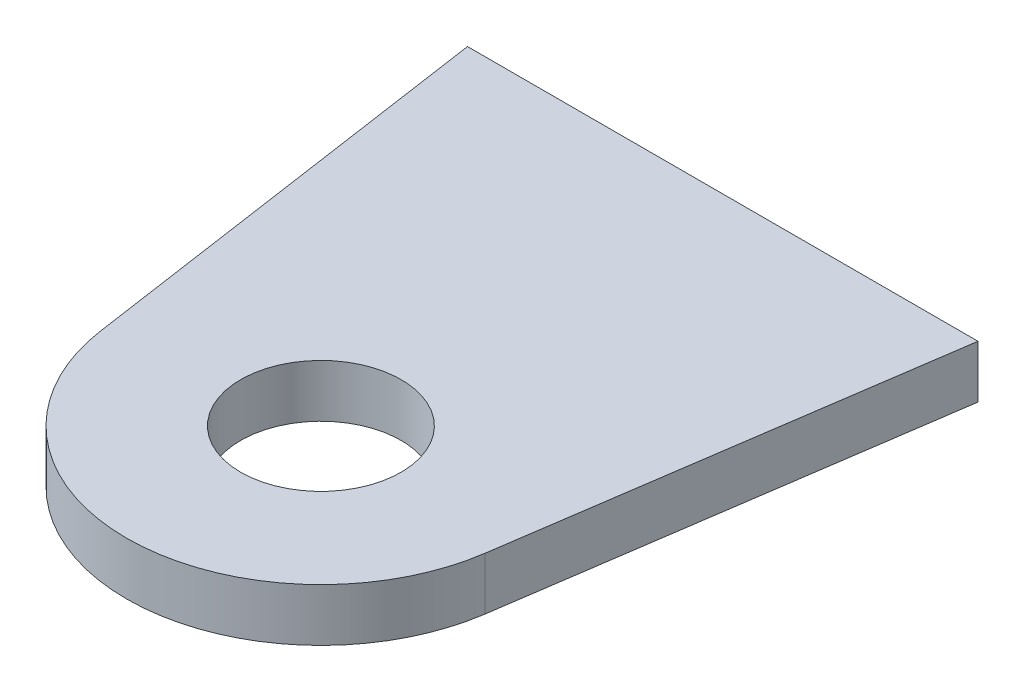
ISO-10303-21;
HEADER;
FILE_DESCRIPTION(('STEP AP214'),'2;1');
FILE_NAME('part.step','',(''),(''),'','','');
FILE_SCHEMA(('AUTOMOTIVE_DESIGN { 1 0 10303 214 1 1 1 1 }'));
ENDSEC;
DATA;
#1=APPLICATION_CONTEXT('core data for automotive mechanical design processes');
#2=APPLICATION_PROTOCOL_DEFINITION('international standard','automotive_design',2000,#1);
#3=PRODUCT_CONTEXT('',#1,'mechanical');
#4=PRODUCT('Part','Part','',(#3));
#5=PRODUCT_RELATED_PRODUCT_CATEGORY('part','',(#4));
#6=PRODUCT_DEFINITION_FORMATION('','',#4);
#7=PRODUCT_DEFINITION_CONTEXT('part definition',#1,'design');
#8=PRODUCT_DEFINITION('design','',#6,#7);
#9=PRODUCT_DEFINITION_SHAPE('','',#8);
#10=(LENGTH_UNIT() NAMED_UNIT(*) SI_UNIT(.MILLI.,.METRE.));
#11=(NAMED_UNIT(*) PLANE_ANGLE_UNIT() SI_UNIT($,.RADIAN.));
#12=(NAMED_UNIT(*) SI_UNIT($,.STERADIAN.) SOLID_ANGLE_UNIT());
#13=UNCERTAINTY_MEASURE_WITH_UNIT(LENGTH_MEASURE(1.E-05),#10,'distance_accuracy_value','');
#14=(GEOMETRIC_REPRESENTATION_CONTEXT(3) GLOBAL_UNCERTAINTY_ASSIGNED_CONTEXT((#13)) GLOBAL_UNIT_ASSIGNED_CONTEXT((#10,
#11,#12)) REPRESENTATION_CONTEXT('',''));
#15=CARTESIAN_POINT('',(0.,0.,0.));
#16=DIRECTION('',(0.,0.,1.));
#17=DIRECTION('',(1.,0.,0.));
#18=AXIS2_PLACEMENT_3D('',#15,#16,#17);
#19=CARTESIAN_POINT('',(-15.875,-1.6383,-24.9936));
#20=DIRECTION('',(-0.989470482255006,0.,0.144734808342864));
#21=DIRECTION('',(0.144734808342864,0.,0.989470482255006));
#22=AXIS2_PLACEMENT_3D('',#19,#20,#21);
#23=PLANE('',#22);
#24=DIRECTION('',(0.144734808342864,0.,0.989470482255006));
#25=VECTOR('',#24,1.);
#26=CARTESIAN_POINT('',(-15.875,1.6383,-24.9936));
#27=LINE('',#26,#25);
#28=CARTESIAN_POINT('',(-15.875,1.6383,-24.9936));
#29=VERTEX_POINT('',#28);
#30=CARTESIAN_POINT('',(-11.9630939186559,1.6383,1.74990172678855));
#31=VERTEX_POINT('',#30);
#32=EDGE_CURVE('E85',#29,#31,#27,.T.);
#33=ORIENTED_EDGE('',*,*,#32,.F.);
#34=DIRECTION('',(0.,1.,0.));
#35=VECTOR('',#34,1.);
#36=CARTESIAN_POINT('',(-15.875,-1.6383,-24.9936));
#37=LINE('',#36,#35);
#38=CARTESIAN_POINT('',(-15.875,-1.6383,-24.9936));
#39=VERTEX_POINT('',#38);
#40=EDGE_CURVE('E31',#39,#29,#37,.T.);
#41=ORIENTED_EDGE('',*,*,#40,.F.);
#42=DIRECTION('',(0.144734808342864,0.,0.989470482255006));
#43=VECTOR('',#42,1.);
#44=CARTESIAN_POINT('',(-15.875,-1.6383,-24.9936));
#45=LINE('',#44,#43);
#46=CARTESIAN_POINT('',(-11.9630939186559,-1.6383,1.74990172678855));
#47=VERTEX_POINT('',#46);
#48=EDGE_CURVE('E70',#39,#47,#45,.T.);
#49=ORIENTED_EDGE('',*,*,#48,.T.);
#50=DIRECTION('',(0.,1.,0.));
#51=VECTOR('',#50,1.);
#52=CARTESIAN_POINT('',(-11.9630939186559,-1.6383,1.74990172678855));
#53=LINE('',#52,#51);
#54=EDGE_CURVE('E9',#47,#31,#53,.T.);
#55=ORIENTED_EDGE('',*,*,#54,.T.);
#56=EDGE_LOOP('',(#33,#41,#49,#55));
#57=FACE_BOUND('',#56,.T.);
#58=ADVANCED_FACE('F15',(#57),#23,.T.);
#59=CARTESIAN_POINT('',(0.,-1.6383,0.));
#60=DIRECTION('',(0.,1.,0.));
#61=DIRECTION('',(0.,0.,1.));
#62=AXIS2_PLACEMENT_3D('',#59,#60,#61);
#63=CYLINDRICAL_SURFACE('',#62,12.0904);
#64=CARTESIAN_POINT('',(0.,1.6383,0.));
#65=DIRECTION('',(0.,1.,0.));
#66=DIRECTION('',(1.,0.,0.));
#67=AXIS2_PLACEMENT_3D('',#64,#65,#66);
#68=CIRCLE('',#67,12.0904);
#69=CARTESIAN_POINT('',(11.9630939186559,1.6383,1.74990172678857));
#70=VERTEX_POINT('',#69);
#71=EDGE_CURVE('E82',#31,#70,#68,.T.);
#72=ORIENTED_EDGE('',*,*,#71,.F.);
#73=ORIENTED_EDGE('',*,*,#54,.F.);
#74=CARTESIAN_POINT('',(0.,-1.6383,0.));
#75=DIRECTION('',(0.,1.,0.));
#76=DIRECTION('',(1.,0.,0.));
#77=AXIS2_PLACEMENT_3D('',#74,#75,#76);
#78=CIRCLE('',#77,12.0904);
#79=CARTESIAN_POINT('',(11.9630939186559,-1.6383,1.74990172678857));
#80=VERTEX_POINT('',#79);
#81=EDGE_CURVE('E66',#47,#80,#78,.T.);
#82=ORIENTED_EDGE('',*,*,#81,.T.);
#83=DIRECTION('',(0.,1.,0.));
#84=VECTOR('',#83,1.);
#85=CARTESIAN_POINT('',(11.9630939186559,-1.6383,1.74990172678857));
#86=LINE('',#85,#84);
#87=EDGE_CURVE('E23',#80,#70,#86,.T.);
#88=ORIENTED_EDGE('',*,*,#87,.T.);
#89=EDGE_LOOP('',(#72,#73,#82,#88));
#90=FACE_BOUND('',#89,.T.);
#91=ADVANCED_FACE('F67',(#90),#63,.T.);
#92=CARTESIAN_POINT('',(11.9630939186559,-1.6383,1.74990172678857));
#93=DIRECTION('',(0.989470482255006,0.,0.144734808342865));
#94=DIRECTION('',(0.144734808342865,0.,-0.989470482255006));
#95=AXIS2_PLACEMENT_3D('',#92,#93,#94);
#96=PLANE('',#95);
#97=DIRECTION('',(0.144734808342865,0.,-0.989470482255006));
#98=VECTOR('',#97,1.);
#99=CARTESIAN_POINT('',(11.9630939186559,1.6383,1.74990172678857));
#100=LINE('',#99,#98);
#101=CARTESIAN_POINT('',(15.875,1.6383,-24.9936));
#102=VERTEX_POINT('',#101);
#103=EDGE_CURVE('E64',#70,#102,#100,.T.);
#104=ORIENTED_EDGE('',*,*,#103,.F.);
#105=ORIENTED_EDGE('',*,*,#87,.F.);
#106=DIRECTION('',(0.144734808342865,0.,-0.989470482255006));
#107=VECTOR('',#106,1.);
#108=CARTESIAN_POINT('',(11.9630939186559,-1.6383,1.74990172678857));
#109=LINE('',#108,#107);
#110=CARTESIAN_POINT('',(15.875,-1.6383,-24.9936));
#111=VERTEX_POINT('',#110);
#112=EDGE_CURVE('E61',#80,#111,#109,.T.);
#113=ORIENTED_EDGE('',*,*,#112,.T.);
#114=DIRECTION('',(0.,1.,0.));
#115=VECTOR('',#114,1.);
#116=CARTESIAN_POINT('',(15.875,-1.6383,-24.9936));
#117=LINE('',#116,#115);
#118=EDGE_CURVE('E47',#111,#102,#117,.T.);
#119=ORIENTED_EDGE('',*,*,#118,.T.);
#120=EDGE_LOOP('',(#104,#105,#113,#119));
#121=FACE_BOUND('',#120,.T.);
#122=ADVANCED_FACE('F59',(#121),#96,.T.);
#123=CARTESIAN_POINT('',(0.,-1.6383,0.));
#124=DIRECTION('',(0.,1.,0.));
#125=DIRECTION('',(0.,0.,1.));
#126=AXIS2_PLACEMENT_3D('',#123,#124,#125);
#127=CYLINDRICAL_SURFACE('',#126,4.9911);
#128=CARTESIAN_POINT('',(0.,-1.6383,0.));
#129=DIRECTION('',(0.,1.,0.));
#130=DIRECTION('',(1.,0.,0.));
#131=AXIS2_PLACEMENT_3D('',#128,#129,#130);
#132=CIRCLE('',#131,4.9911);
#133=CARTESIAN_POINT('',(0.,-1.6383,4.9911));
#134=VERTEX_POINT('',#133);
#135=EDGE_CURVE('E75',#134,#134,#132,.T.);
#136=CARTESIAN_POINT('',(0.,1.6383,0.));
#137=DIRECTION('',(0.,1.,0.));
#138=DIRECTION('',(1.,0.,0.));
#139=AXIS2_PLACEMENT_3D('',#136,#137,#138);
#140=CIRCLE('',#139,4.9911);
#141=CARTESIAN_POINT('',(0.,1.6383,4.9911));
#142=VERTEX_POINT('',#141);
#143=EDGE_CURVE('E79',#142,#142,#140,.T.);
#144=CARTESIAN_POINT('',(0.,-1.6383,4.9911));
#145=CARTESIAN_POINT('',(0.,-1.60416875,4.9911));
#146=CARTESIAN_POINT('',(0.,-1.5700375,4.9911));
#147=CARTESIAN_POINT('',(0.,-1.501775,4.9911));
#148=CARTESIAN_POINT('',(0.,-1.46764375,4.9911));
#149=CARTESIAN_POINT('',(0.,-1.39938125,4.9911));
#150=CARTESIAN_POINT('',(0.,-1.36525,4.9911));
#151=CARTESIAN_POINT('',(0.,-1.2969875,4.9911));
#152=CARTESIAN_POINT('',(0.,-1.26285625,4.9911));
#153=CARTESIAN_POINT('',(0.,-1.19459375,4.9911));
#154=CARTESIAN_POINT('',(0.,-1.1604625,4.9911));
#155=CARTESIAN_POINT('',(0.,-1.0922,4.9911));
#156=CARTESIAN_POINT('',(0.,-1.05806875,4.9911));
#157=CARTESIAN_POINT('',(0.,-0.98980625,4.9911));
#158=CARTESIAN_POINT('',(0.,-0.955675,4.9911));
#159=CARTESIAN_POINT('',(0.,-0.8874125,4.9911));
#160=CARTESIAN_POINT('',(0.,-0.85328125,4.9911));
#161=CARTESIAN_POINT('',(0.,-0.78501875,4.9911));
#162=CARTESIAN_POINT('',(0.,-0.7508875,4.9911));
#163=CARTESIAN_POINT('',(0.,-0.682625,4.9911));
#164=CARTESIAN_POINT('',(0.,-0.64849375,4.9911));
#165=CARTESIAN_POINT('',(0.,-0.58023125,4.9911));
#166=CARTESIAN_POINT('',(0.,-0.5461,4.9911));
#167=CARTESIAN_POINT('',(0.,-0.4778375,4.9911));
#168=CARTESIAN_POINT('',(0.,-0.44370625,4.9911));
#169=CARTESIAN_POINT('',(0.,-0.37544375,4.9911));
#170=CARTESIAN_POINT('',(0.,-0.3413125,4.9911));
#171=CARTESIAN_POINT('',(0.,-0.27305,4.9911));
#172=CARTESIAN_POINT('',(0.,-0.23891875,4.9911));
#173=CARTESIAN_POINT('',(0.,-0.17065625,4.9911));
#174=CARTESIAN_POINT('',(0.,-0.136525,4.9911));
#175=CARTESIAN_POINT('',(0.,-0.0682625000000002,4.9911));
#176=CARTESIAN_POINT('',(0.,-0.0341312500000002,4.9911));
#177=CARTESIAN_POINT('',(0.,0.0341312499999998,4.9911));
#178=CARTESIAN_POINT('',(0.,0.0682624999999997,4.9911));
#179=CARTESIAN_POINT('',(0.,0.136525,4.9911));
#180=CARTESIAN_POINT('',(0.,0.17065625,4.9911));
#181=CARTESIAN_POINT('',(0.,0.23891875,4.9911));
#182=CARTESIAN_POINT('',(0.,0.27305,4.9911));
#183=CARTESIAN_POINT('',(0.,0.3413125,4.9911));
#184=CARTESIAN_POINT('',(0.,0.37544375,4.9911));
#185=CARTESIAN_POINT('',(0.,0.44370625,4.9911));
#186=CARTESIAN_POINT('',(0.,0.477837499999999,4.9911));
#187=CARTESIAN_POINT('',(0.,0.546099999999999,4.9911));
#188=CARTESIAN_POINT('',(0.,0.58023125,4.9911));
#189=CARTESIAN_POINT('',(0.,0.64849375,4.9911));
#190=CARTESIAN_POINT('',(0.,0.682625,4.9911));
#191=CARTESIAN_POINT('',(0.,0.7508875,4.9911));
#192=CARTESIAN_POINT('',(0.,0.785018749999999,4.9911));
#193=CARTESIAN_POINT('',(0.,0.853281249999999,4.9911));
#194=CARTESIAN_POINT('',(0.,0.887412499999999,4.9911));
#195=CARTESIAN_POINT('',(0.,0.955675,4.9911));
#196=CARTESIAN_POINT('',(0.,0.98980625,4.9911));
#197=CARTESIAN_POINT('',(0.,1.05806875,4.9911));
#198=CARTESIAN_POINT('',(0.,1.0922,4.9911));
#199=CARTESIAN_POINT('',(0.,1.1604625,4.9911));
#200=CARTESIAN_POINT('',(0.,1.19459375,4.9911));
#201=CARTESIAN_POINT('',(0.,1.26285625,4.9911));
#202=CARTESIAN_POINT('',(0.,1.2969875,4.9911));
#203=CARTESIAN_POINT('',(0.,1.36525,4.9911));
#204=CARTESIAN_POINT('',(0.,1.39938125,4.9911));
#205=CARTESIAN_POINT('',(0.,1.46764375,4.9911));
#206=CARTESIAN_POINT('',(0.,1.501775,4.9911));
#207=CARTESIAN_POINT('',(0.,1.5700375,4.9911));
#208=CARTESIAN_POINT('',(0.,1.60416875,4.9911));
#209=CARTESIAN_POINT('',(0.,1.6383,4.9911));
#210=B_SPLINE_CURVE_WITH_KNOTS('',3,(#144,#145,#146,#147,#148,#149,#150,#151,#152,#153,#154,
#155,#156,#157,#158,#159,#160,#161,#162,#163,#164,#165,#166,#167,#168,#169,#170,#171,#172,#173,
#174,#175,#176,#177,#178,#179,#180,#181,#182,#183,#184,#185,#186,#187,#188,#189,#190,#191,#192,
#193,#194,#195,#196,#197,#198,#199,#200,#201,#202,#203,#204,#205,#206,#207,#208,#209),
.UNSPECIFIED.,.F.,.F.,(4,2,2,2,2,2,2,2,2,2,2,2,2,2,2,2,2,2,2,2,2,2,2,2,2,2,2,2,2,2,2,2,4),(0.,
0.10239375,0.2047875,0.30718125,0.409575,0.51196875,0.6143625,0.71675625,0.81915,0.92154375,
1.0239375,1.12633125,1.228725,1.33111875,1.4335125,1.53590625,1.6383,1.74069375,1.8430875,
1.94548125,2.047875,2.15026875,2.2526625,2.35505625,2.45745,2.55984375,2.6622375,2.76463125,
2.867025,2.96941875,3.0718125,3.17420625,3.2766),.UNSPECIFIED.);
#211=EDGE_CURVE('BSEAM102',#134,#142,#210,.T.);
#212=ORIENTED_EDGE('',*,*,#135,.F.);
#213=ORIENTED_EDGE('',*,*,#143,.T.);
#214=ORIENTED_EDGE('',*,*,#211,.T.);
#215=ORIENTED_EDGE('',*,*,#211,.F.);
#216=EDGE_LOOP('',(#212,#214,#213,#215));
#217=FACE_BOUND('',#216,.T.);
#218=ADVANCED_FACE('F102',(#217),#127,.F.);
#219=CARTESIAN_POINT('',(15.875,-1.6383,-24.9936));
#220=DIRECTION('',(0.,0.,-1.));
#221=DIRECTION('',(-1.,0.,0.));
#222=AXIS2_PLACEMENT_3D('',#219,#220,#221);
#223=PLANE('',#222);
#224=DIRECTION('',(-1.,0.,0.));
#225=VECTOR('',#224,1.);
#226=CARTESIAN_POINT('',(15.875,1.6383,-24.9936));
#227=LINE('',#226,#225);
#228=EDGE_CURVE('E88',#102,#29,#227,.T.);
#229=ORIENTED_EDGE('',*,*,#228,.F.);
#230=ORIENTED_EDGE('',*,*,#118,.F.);
#231=DIRECTION('',(-1.,0.,0.));
#232=VECTOR('',#231,1.);
#233=CARTESIAN_POINT('',(15.875,-1.6383,-24.9936));
#234=LINE('',#233,#232);
#235=EDGE_CURVE('E73',#111,#39,#234,.T.);
#236=ORIENTED_EDGE('',*,*,#235,.T.);
#237=ORIENTED_EDGE('',*,*,#40,.T.);
#238=EDGE_LOOP('',(#229,#230,#236,#237));
#239=FACE_BOUND('',#238,.T.);
#240=ADVANCED_FACE('F118',(#239),#223,.T.);
#241=CARTESIAN_POINT('',(0.,-1.6383,0.));
#242=DIRECTION('',(0.,1.,0.));
#243=DIRECTION('',(0.,0.,1.));
#244=AXIS2_PLACEMENT_3D('',#241,#242,#243);
#245=PLANE('',#244);
#246=ORIENTED_EDGE('',*,*,#135,.T.);
#247=EDGE_LOOP('',(#246));
#248=FACE_BOUND('',#247,.T.);
#249=ORIENTED_EDGE('',*,*,#48,.F.);
#250=ORIENTED_EDGE('',*,*,#235,.F.);
#251=ORIENTED_EDGE('',*,*,#112,.F.);
#252=ORIENTED_EDGE('',*,*,#81,.F.);
#253=EDGE_LOOP('',(#249,#250,#251,#252));
#254=FACE_BOUND('',#253,.T.);
#255=ADVANCED_FACE('F72',(#248,#254),#245,.F.);
#256=CARTESIAN_POINT('',(0.,1.6383,0.));
#257=DIRECTION('',(0.,1.,0.));
#258=DIRECTION('',(0.,0.,1.));
#259=AXIS2_PLACEMENT_3D('',#256,#257,#258);
#260=PLANE('',#259);
#261=ORIENTED_EDGE('',*,*,#143,.F.);
#262=EDGE_LOOP('',(#261));
#263=FACE_BOUND('',#262,.T.);
#264=ORIENTED_EDGE('',*,*,#32,.T.);
#265=ORIENTED_EDGE('',*,*,#71,.T.);
#266=ORIENTED_EDGE('',*,*,#103,.T.);
#267=ORIENTED_EDGE('',*,*,#228,.T.);
#268=EDGE_LOOP('',(#264,#265,#266,#267));
#269=FACE_BOUND('',#268,.T.);
#270=ADVANCED_FACE('F104',(#263,#269),#260,.T.);
#271=CLOSED_SHELL('',(#58,#91,#122,#218,#240,#255,#270));
#272=MANIFOLD_SOLID_BREP('B1',#271);
#273=ADVANCED_BREP_SHAPE_REPRESENTATION('',(#18,#272),#14);
#274=SHAPE_DEFINITION_REPRESENTATION(#9,#273);
ENDSEC;
END-ISO-10303-21;
